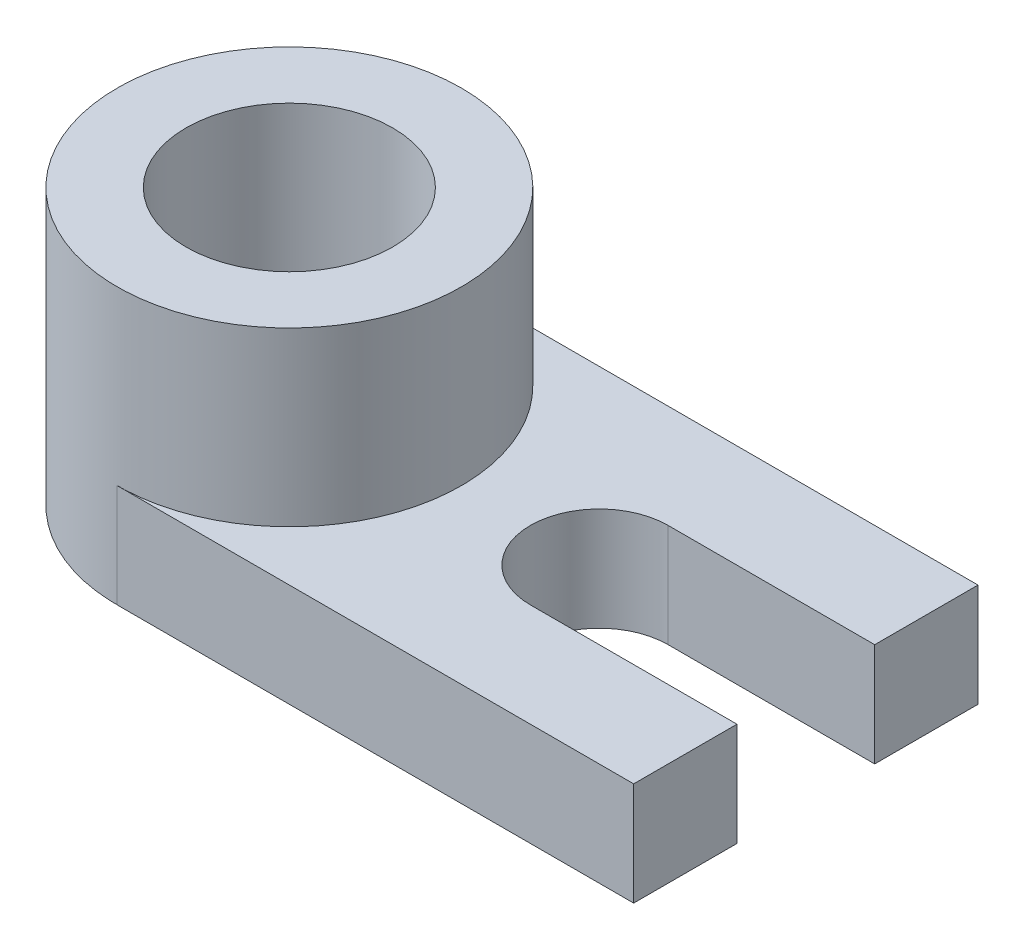
ISO-10303-21;
HEADER;
FILE_DESCRIPTION(('STEP AP214'),'2;1');
FILE_NAME('part.step','',(''),(''),'','','');
FILE_SCHEMA(('AUTOMOTIVE_DESIGN { 1 0 10303 214 1 1 1 1 }'));
ENDSEC;
DATA;
#1=APPLICATION_CONTEXT('core data for automotive mechanical design processes');
#2=APPLICATION_PROTOCOL_DEFINITION('international standard','automotive_design',2000,#1);
#3=PRODUCT_CONTEXT('',#1,'mechanical');
#4=PRODUCT('Part','Part','',(#3));
#5=PRODUCT_RELATED_PRODUCT_CATEGORY('part','',(#4));
#6=PRODUCT_DEFINITION_FORMATION('','',#4);
#7=PRODUCT_DEFINITION_CONTEXT('part definition',#1,'design');
#8=PRODUCT_DEFINITION('design','',#6,#7);
#9=PRODUCT_DEFINITION_SHAPE('','',#8);
#10=(LENGTH_UNIT() NAMED_UNIT(*) SI_UNIT(.MILLI.,.METRE.));
#11=(NAMED_UNIT(*) PLANE_ANGLE_UNIT() SI_UNIT($,.RADIAN.));
#12=(NAMED_UNIT(*) SI_UNIT($,.STERADIAN.) SOLID_ANGLE_UNIT());
#13=UNCERTAINTY_MEASURE_WITH_UNIT(LENGTH_MEASURE(1.E-05),#10,'distance_accuracy_value','');
#14=(GEOMETRIC_REPRESENTATION_CONTEXT(3) GLOBAL_UNCERTAINTY_ASSIGNED_CONTEXT((#13)) GLOBAL_UNIT_ASSIGNED_CONTEXT((#10,
#11,#12)) REPRESENTATION_CONTEXT('',''));
#15=CARTESIAN_POINT('',(0.,0.,0.));
#16=DIRECTION('',(0.,0.,1.));
#17=DIRECTION('',(1.,0.,0.));
#18=AXIS2_PLACEMENT_3D('',#15,#16,#17);
#19=CARTESIAN_POINT('',(0.,40.,-25.));
#20=DIRECTION('',(0.,-1.,0.));
#21=DIRECTION('',(0.,0.,-1.));
#22=AXIS2_PLACEMENT_3D('',#19,#20,#21);
#23=CYLINDRICAL_SURFACE('',#22,25.);
#24=CARTESIAN_POINT('',(0.,40.,-25.));
#25=DIRECTION('',(0.,-1.,0.));
#26=DIRECTION('',(0.,0.,-1.));
#27=AXIS2_PLACEMENT_3D('',#24,#25,#26);
#28=CIRCLE('',#27,25.);
#29=CARTESIAN_POINT('',(0.,40.,-50.));
#30=VERTEX_POINT('',#29);
#31=EDGE_CURVE('E11',#30,#30,#28,.T.);
#32=ORIENTED_EDGE('',*,*,#31,.T.);
#33=EDGE_LOOP('',(#32));
#34=FACE_BOUND('',#33,.T.);
#35=CARTESIAN_POINT('',(0.,0.,-25.));
#36=DIRECTION('',(0.,-1.,0.));
#37=DIRECTION('',(0.,0.,-1.));
#38=AXIS2_PLACEMENT_3D('',#35,#36,#37);
#39=CIRCLE('',#38,25.);
#40=CARTESIAN_POINT('',(0.,0.,-50.));
#41=VERTEX_POINT('',#40);
#42=EDGE_CURVE('E50',#41,#41,#39,.T.);
#43=ORIENTED_EDGE('',*,*,#42,.F.);
#44=EDGE_LOOP('',(#43));
#45=FACE_BOUND('',#44,.T.);
#46=ADVANCED_FACE('F47',(#34,#45),#23,.T.);
#47=CARTESIAN_POINT('',(0.,40.,-25.));
#48=DIRECTION('',(0.,-1.,0.));
#49=DIRECTION('',(0.,0.,-1.));
#50=AXIS2_PLACEMENT_3D('',#47,#48,#49);
#51=PLANE('',#50);
#52=CARTESIAN_POINT('',(0.,40.,-25.));
#53=DIRECTION('',(0.,1.,0.));
#54=DIRECTION('',(0.,0.,1.));
#55=AXIS2_PLACEMENT_3D('',#52,#53,#54);
#56=CIRCLE('',#55,15.);
#57=CARTESIAN_POINT('',(0.,40.,-10.));
#58=VERTEX_POINT('',#57);
#59=EDGE_CURVE('E61',#58,#58,#56,.T.);
#60=ORIENTED_EDGE('',*,*,#59,.F.);
#61=EDGE_LOOP('',(#60));
#62=FACE_BOUND('',#61,.T.);
#63=ORIENTED_EDGE('',*,*,#31,.F.);
#64=EDGE_LOOP('',(#63));
#65=FACE_BOUND('',#64,.T.);
#66=ADVANCED_FACE('F78',(#62,#65),#51,.F.);
#67=CARTESIAN_POINT('',(0.,0.,-25.));
#68=DIRECTION('',(0.,-1.,0.));
#69=DIRECTION('',(0.,0.,-1.));
#70=AXIS2_PLACEMENT_3D('',#67,#68,#69);
#71=PLANE('',#70);
#72=CARTESIAN_POINT('',(0.,0.,-25.));
#73=DIRECTION('',(0.,1.,0.));
#74=DIRECTION('',(0.,0.,1.));
#75=AXIS2_PLACEMENT_3D('',#72,#73,#74);
#76=CIRCLE('',#75,15.);
#77=CARTESIAN_POINT('',(0.,0.,-10.));
#78=VERTEX_POINT('',#77);
#79=EDGE_CURVE('E59',#78,#78,#76,.T.);
#80=ORIENTED_EDGE('',*,*,#79,.T.);
#81=EDGE_LOOP('',(#80));
#82=FACE_BOUND('',#81,.T.);
#83=ORIENTED_EDGE('',*,*,#42,.T.);
#84=EDGE_LOOP('',(#83));
#85=FACE_BOUND('',#84,.T.);
#86=ADVANCED_FACE('F69',(#82,#85),#71,.T.);
#87=CARTESIAN_POINT('',(0.,0.,-25.));
#88=DIRECTION('',(0.,1.,0.));
#89=DIRECTION('',(0.,0.,1.));
#90=AXIS2_PLACEMENT_3D('',#87,#88,#89);
#91=CYLINDRICAL_SURFACE('',#90,15.);
#92=ORIENTED_EDGE('',*,*,#79,.F.);
#93=EDGE_LOOP('',(#92));
#94=FACE_BOUND('',#93,.T.);
#95=ORIENTED_EDGE('',*,*,#59,.T.);
#96=EDGE_LOOP('',(#95));
#97=FACE_BOUND('',#96,.T.);
#98=ADVANCED_FACE('F72',(#94,#97),#91,.F.);
#99=CLOSED_SHELL('',(#46,#66,#86,#98));
#100=MANIFOLD_SOLID_BREP('B2',#99);
#101=CARTESIAN_POINT('',(75.,15.,-50.));
#102=DIRECTION('',(-1.,0.,0.));
#103=DIRECTION('',(0.,0.,1.));
#104=AXIS2_PLACEMENT_3D('',#101,#102,#103);
#105=PLANE('',#104);
#106=DIRECTION('',(0.,0.,-1.));
#107=VECTOR('',#106,1.);
#108=CARTESIAN_POINT('',(75.,0.,-50.));
#109=LINE('',#108,#107);
#110=CARTESIAN_POINT('',(75.,0.,0.));
#111=VERTEX_POINT('',#110);
#112=CARTESIAN_POINT('',(75.,0.,-15.));
#113=VERTEX_POINT('',#112);
#114=EDGE_CURVE('E204',#111,#113,#109,.T.);
#115=ORIENTED_EDGE('',*,*,#114,.T.);
#116=DIRECTION('',(0.,-1.,0.));
#117=VECTOR('',#116,1.);
#118=CARTESIAN_POINT('',(75.,15.,-15.));
#119=LINE('',#118,#117);
#120=CARTESIAN_POINT('',(75.,15.,-15.));
#121=VERTEX_POINT('',#120);
#122=EDGE_CURVE('E188',#121,#113,#119,.T.);
#123=ORIENTED_EDGE('',*,*,#122,.F.);
#124=DIRECTION('',(0.,0.,-1.));
#125=VECTOR('',#124,1.);
#126=CARTESIAN_POINT('',(75.,15.,-50.));
#127=LINE('',#126,#125);
#128=CARTESIAN_POINT('',(75.,15.,0.));
#129=VERTEX_POINT('',#128);
#130=EDGE_CURVE('E248',#129,#121,#127,.T.);
#131=ORIENTED_EDGE('',*,*,#130,.F.);
#132=DIRECTION('',(0.,-1.,0.));
#133=VECTOR('',#132,1.);
#134=CARTESIAN_POINT('',(75.,15.,0.));
#135=LINE('',#134,#133);
#136=EDGE_CURVE('E121',#129,#111,#135,.T.);
#137=ORIENTED_EDGE('',*,*,#136,.T.);
#138=EDGE_LOOP('',(#115,#123,#131,#137));
#139=FACE_BOUND('',#138,.T.);
#140=ADVANCED_FACE('F113',(#139),#105,.F.);
#141=CARTESIAN_POINT('',(0.,15.,-50.));
#142=DIRECTION('',(1.,0.,0.));
#143=DIRECTION('',(0.,0.,-1.));
#144=AXIS2_PLACEMENT_3D('',#141,#142,#143);
#145=PLANE('',#144);
#146=DIRECTION('',(0.,0.,1.));
#147=VECTOR('',#146,1.);
#148=CARTESIAN_POINT('',(0.,0.,-50.));
#149=LINE('',#148,#147);
#150=CARTESIAN_POINT('',(0.,0.,-50.));
#151=VERTEX_POINT('',#150);
#152=CARTESIAN_POINT('',(0.,0.,-40.));
#153=VERTEX_POINT('',#152);
#154=EDGE_CURVE('E239',#151,#153,#149,.T.);
#155=ORIENTED_EDGE('',*,*,#154,.T.);
#156=DIRECTION('',(0.,1.,0.));
#157=VECTOR('',#156,1.);
#158=CARTESIAN_POINT('',(0.,0.,-40.));
#159=LINE('',#158,#157);
#160=CARTESIAN_POINT('',(0.,15.,-40.));
#161=VERTEX_POINT('',#160);
#162=EDGE_CURVE('E245',#153,#161,#159,.T.);
#163=ORIENTED_EDGE('',*,*,#162,.T.);
#164=DIRECTION('',(0.,0.,1.));
#165=VECTOR('',#164,1.);
#166=CARTESIAN_POINT('',(0.,15.,-50.));
#167=LINE('',#166,#165);
#168=CARTESIAN_POINT('',(0.,15.,-50.));
#169=VERTEX_POINT('',#168);
#170=EDGE_CURVE('E253',#169,#161,#167,.T.);
#171=ORIENTED_EDGE('',*,*,#170,.F.);
#172=DIRECTION('',(0.,-1.,0.));
#173=VECTOR('',#172,1.);
#174=CARTESIAN_POINT('',(0.,15.,-50.));
#175=LINE('',#174,#173);
#176=EDGE_CURVE('E221',#169,#151,#175,.T.);
#177=ORIENTED_EDGE('',*,*,#176,.T.);
#178=EDGE_LOOP('',(#155,#163,#171,#177));
#179=FACE_BOUND('',#178,.T.);
#180=ADVANCED_FACE('F288',(#179),#145,.F.);
#181=CARTESIAN_POINT('',(0.,15.,-10.));
#182=VERTEX_POINT('',#181);
#183=CARTESIAN_POINT('',(0.,15.,0.));
#184=VERTEX_POINT('',#183);
#185=EDGE_CURVE('E215',#182,#184,#167,.T.);
#186=ORIENTED_EDGE('',*,*,#185,.F.);
#187=DIRECTION('',(0.,1.,0.));
#188=VECTOR('',#187,1.);
#189=CARTESIAN_POINT('',(0.,0.,-10.));
#190=LINE('',#189,#188);
#191=CARTESIAN_POINT('',(0.,0.,-10.));
#192=VERTEX_POINT('',#191);
#193=EDGE_CURVE('E257',#182,#192,#190,.F.);
#194=ORIENTED_EDGE('',*,*,#193,.T.);
#195=CARTESIAN_POINT('',(0.,0.,0.));
#196=VERTEX_POINT('',#195);
#197=EDGE_CURVE('E244',#192,#196,#149,.T.);
#198=ORIENTED_EDGE('',*,*,#197,.T.);
#199=DIRECTION('',(0.,-1.,0.));
#200=VECTOR('',#199,1.);
#201=CARTESIAN_POINT('',(0.,15.,0.));
#202=LINE('',#201,#200);
#203=EDGE_CURVE('E45',#184,#196,#202,.T.);
#204=ORIENTED_EDGE('',*,*,#203,.F.);
#205=EDGE_LOOP('',(#186,#194,#198,#204));
#206=FACE_BOUND('',#205,.T.);
#207=ADVANCED_FACE('F115',(#206),#145,.F.);
#208=CARTESIAN_POINT('',(0.,15.,0.));
#209=DIRECTION('',(0.,0.,-1.));
#210=DIRECTION('',(-1.,0.,0.));
#211=AXIS2_PLACEMENT_3D('',#208,#209,#210);
#212=PLANE('',#211);
#213=DIRECTION('',(1.,0.,0.));
#214=VECTOR('',#213,1.);
#215=CARTESIAN_POINT('',(0.,0.,0.));
#216=LINE('',#215,#214);
#217=EDGE_CURVE('E217',#196,#111,#216,.T.);
#218=ORIENTED_EDGE('',*,*,#217,.T.);
#219=ORIENTED_EDGE('',*,*,#136,.F.);
#220=DIRECTION('',(1.,0.,0.));
#221=VECTOR('',#220,1.);
#222=CARTESIAN_POINT('',(0.,15.,0.));
#223=LINE('',#222,#221);
#224=EDGE_CURVE('E251',#184,#129,#223,.T.);
#225=ORIENTED_EDGE('',*,*,#224,.F.);
#226=ORIENTED_EDGE('',*,*,#203,.T.);
#227=EDGE_LOOP('',(#218,#219,#225,#226));
#228=FACE_BOUND('',#227,.T.);
#229=ADVANCED_FACE('F283',(#228),#212,.F.);
#230=CARTESIAN_POINT('',(75.,15.,-35.));
#231=VERTEX_POINT('',#230);
#232=CARTESIAN_POINT('',(75.,15.,-50.));
#233=VERTEX_POINT('',#232);
#234=EDGE_CURVE('E250',#231,#233,#127,.T.);
#235=ORIENTED_EDGE('',*,*,#234,.F.);
#236=DIRECTION('',(0.,1.,0.));
#237=VECTOR('',#236,1.);
#238=CARTESIAN_POINT('',(75.,15.,-35.));
#239=LINE('',#238,#237);
#240=CARTESIAN_POINT('',(75.,0.,-35.));
#241=VERTEX_POINT('',#240);
#242=EDGE_CURVE('E196',#241,#231,#239,.T.);
#243=ORIENTED_EDGE('',*,*,#242,.F.);
#244=CARTESIAN_POINT('',(75.,0.,-50.));
#245=VERTEX_POINT('',#244);
#246=EDGE_CURVE('E213',#241,#245,#109,.T.);
#247=ORIENTED_EDGE('',*,*,#246,.T.);
#248=DIRECTION('',(0.,-1.,0.));
#249=VECTOR('',#248,1.);
#250=CARTESIAN_POINT('',(75.,15.,-50.));
#251=LINE('',#250,#249);
#252=EDGE_CURVE('E224',#233,#245,#251,.T.);
#253=ORIENTED_EDGE('',*,*,#252,.F.);
#254=EDGE_LOOP('',(#235,#243,#247,#253));
#255=FACE_BOUND('',#254,.T.);
#256=ADVANCED_FACE('F295',(#255),#105,.F.);
#257=CARTESIAN_POINT('',(0.,15.,-50.));
#258=DIRECTION('',(0.,0.,1.));
#259=DIRECTION('',(1.,0.,0.));
#260=AXIS2_PLACEMENT_3D('',#257,#258,#259);
#261=PLANE('',#260);
#262=DIRECTION('',(-1.,0.,0.));
#263=VECTOR('',#262,1.);
#264=CARTESIAN_POINT('',(0.,0.,-50.));
#265=LINE('',#264,#263);
#266=EDGE_CURVE('E212',#245,#151,#265,.T.);
#267=ORIENTED_EDGE('',*,*,#266,.T.);
#268=ORIENTED_EDGE('',*,*,#176,.F.);
#269=DIRECTION('',(-1.,0.,0.));
#270=VECTOR('',#269,1.);
#271=CARTESIAN_POINT('',(0.,15.,-50.));
#272=LINE('',#271,#270);
#273=EDGE_CURVE('E225',#233,#169,#272,.T.);
#274=ORIENTED_EDGE('',*,*,#273,.F.);
#275=ORIENTED_EDGE('',*,*,#252,.T.);
#276=EDGE_LOOP('',(#267,#268,#274,#275));
#277=FACE_BOUND('',#276,.T.);
#278=ADVANCED_FACE('F231',(#277),#261,.F.);
#279=CARTESIAN_POINT('',(0.,15.,0.));
#280=DIRECTION('',(0.,1.,0.));
#281=DIRECTION('',(0.,0.,1.));
#282=AXIS2_PLACEMENT_3D('',#279,#280,#281);
#283=PLANE('',#282);
#284=DIRECTION('',(1.,0.,0.));
#285=VECTOR('',#284,1.);
#286=CARTESIAN_POINT('',(-25.001,15.,-15.));
#287=LINE('',#286,#285);
#288=CARTESIAN_POINT('',(45.,15.,-15.));
#289=VERTEX_POINT('',#288);
#290=EDGE_CURVE('E191',#289,#121,#287,.T.);
#291=ORIENTED_EDGE('',*,*,#290,.F.);
#292=CARTESIAN_POINT('',(45.,15.,-25.));
#293=DIRECTION('',(0.,1.,0.));
#294=DIRECTION('',(0.,0.,1.));
#295=AXIS2_PLACEMENT_3D('',#292,#293,#294);
#296=CIRCLE('',#295,9.99999999999999);
#297=CARTESIAN_POINT('',(45.,15.,-35.));
#298=VERTEX_POINT('',#297);
#299=EDGE_CURVE('E264',#298,#289,#296,.T.);
#300=ORIENTED_EDGE('',*,*,#299,.F.);
#301=DIRECTION('',(1.,0.,0.));
#302=VECTOR('',#301,1.);
#303=CARTESIAN_POINT('',(-25.001,15.,-35.));
#304=LINE('',#303,#302);
#305=EDGE_CURVE('E128',#298,#231,#304,.T.);
#306=ORIENTED_EDGE('',*,*,#305,.T.);
#307=ORIENTED_EDGE('',*,*,#234,.T.);
#308=ORIENTED_EDGE('',*,*,#273,.T.);
#309=ORIENTED_EDGE('',*,*,#170,.T.);
#310=CARTESIAN_POINT('',(0.,15.,-25.));
#311=DIRECTION('',(0.,1.,0.));
#312=DIRECTION('',(0.,0.,1.));
#313=AXIS2_PLACEMENT_3D('',#310,#311,#312);
#314=CIRCLE('',#313,15.);
#315=EDGE_CURVE('E260',#182,#161,#314,.T.);
#316=ORIENTED_EDGE('',*,*,#315,.F.);
#317=ORIENTED_EDGE('',*,*,#185,.T.);
#318=ORIENTED_EDGE('',*,*,#224,.T.);
#319=ORIENTED_EDGE('',*,*,#130,.T.);
#320=EDGE_LOOP('',(#291,#300,#306,#307,#308,#309,#316,#317,#318,#319));
#321=FACE_BOUND('',#320,.T.);
#322=ADVANCED_FACE('F277',(#321),#283,.T.);
#323=CARTESIAN_POINT('',(0.,0.,0.));
#324=DIRECTION('',(0.,1.,0.));
#325=DIRECTION('',(0.,0.,1.));
#326=AXIS2_PLACEMENT_3D('',#323,#324,#325);
#327=PLANE('',#326);
#328=CARTESIAN_POINT('',(45.,0.,-25.));
#329=DIRECTION('',(0.,1.,0.));
#330=DIRECTION('',(0.,0.,1.));
#331=AXIS2_PLACEMENT_3D('',#328,#329,#330);
#332=CIRCLE('',#331,9.99999999999999);
#333=CARTESIAN_POINT('',(45.,0.,-35.));
#334=VERTEX_POINT('',#333);
#335=CARTESIAN_POINT('',(45.,0.,-15.));
#336=VERTEX_POINT('',#335);
#337=EDGE_CURVE('E207',#334,#336,#332,.T.);
#338=ORIENTED_EDGE('',*,*,#337,.T.);
#339=DIRECTION('',(1.,0.,0.));
#340=VECTOR('',#339,1.);
#341=CARTESIAN_POINT('',(-25.001,0.,-15.));
#342=LINE('',#341,#340);
#343=EDGE_CURVE('E136',#336,#113,#342,.T.);
#344=ORIENTED_EDGE('',*,*,#343,.T.);
#345=ORIENTED_EDGE('',*,*,#114,.F.);
#346=ORIENTED_EDGE('',*,*,#217,.F.);
#347=ORIENTED_EDGE('',*,*,#197,.F.);
#348=CARTESIAN_POINT('',(0.,0.,-25.));
#349=DIRECTION('',(0.,1.,0.));
#350=DIRECTION('',(0.,0.,1.));
#351=AXIS2_PLACEMENT_3D('',#348,#349,#350);
#352=CIRCLE('',#351,15.);
#353=EDGE_CURVE('E241',#192,#153,#352,.T.);
#354=ORIENTED_EDGE('',*,*,#353,.T.);
#355=ORIENTED_EDGE('',*,*,#154,.F.);
#356=ORIENTED_EDGE('',*,*,#266,.F.);
#357=ORIENTED_EDGE('',*,*,#246,.F.);
#358=DIRECTION('',(1.,0.,0.));
#359=VECTOR('',#358,1.);
#360=CARTESIAN_POINT('',(-25.001,0.,-35.));
#361=LINE('',#360,#359);
#362=EDGE_CURVE('E208',#334,#241,#361,.T.);
#363=ORIENTED_EDGE('',*,*,#362,.F.);
#364=EDGE_LOOP('',(#338,#344,#345,#346,#347,#354,#355,#356,#357,#363));
#365=FACE_BOUND('',#364,.T.);
#366=ADVANCED_FACE('F202',(#365),#327,.F.);
#367=CARTESIAN_POINT('',(0.,0.,-25.));
#368=DIRECTION('',(0.,1.,0.));
#369=DIRECTION('',(0.,0.,1.));
#370=AXIS2_PLACEMENT_3D('',#367,#368,#369);
#371=CYLINDRICAL_SURFACE('',#370,15.);
#372=ORIENTED_EDGE('',*,*,#353,.F.);
#373=ORIENTED_EDGE('',*,*,#193,.F.);
#374=ORIENTED_EDGE('',*,*,#315,.T.);
#375=ORIENTED_EDGE('',*,*,#162,.F.);
#376=EDGE_LOOP('',(#372,#373,#374,#375));
#377=FACE_BOUND('',#376,.T.);
#378=ADVANCED_FACE('F286',(#377),#371,.F.);
#379=CARTESIAN_POINT('',(45.,15.,-25.));
#380=DIRECTION('',(0.,1.,0.));
#381=DIRECTION('',(0.,0.,1.));
#382=AXIS2_PLACEMENT_3D('',#379,#380,#381);
#383=CYLINDRICAL_SURFACE('',#382,9.99999999999999);
#384=ORIENTED_EDGE('',*,*,#299,.T.);
#385=DIRECTION('',(0.,1.,0.));
#386=VECTOR('',#385,1.);
#387=CARTESIAN_POINT('',(45.,15.,-15.));
#388=LINE('',#387,#386);
#389=EDGE_CURVE('E197',#336,#289,#388,.T.);
#390=ORIENTED_EDGE('',*,*,#389,.F.);
#391=ORIENTED_EDGE('',*,*,#337,.F.);
#392=DIRECTION('',(0.,1.,0.));
#393=VECTOR('',#392,1.);
#394=CARTESIAN_POINT('',(45.,15.,-35.));
#395=LINE('',#394,#393);
#396=EDGE_CURVE('E272',#334,#298,#395,.T.);
#397=ORIENTED_EDGE('',*,*,#396,.T.);
#398=EDGE_LOOP('',(#384,#390,#391,#397));
#399=FACE_BOUND('',#398,.T.);
#400=ADVANCED_FACE('F275',(#399),#383,.F.);
#401=CARTESIAN_POINT('',(-25.001,15.,-35.));
#402=DIRECTION('',(0.,0.,-1.));
#403=DIRECTION('',(-1.,0.,0.));
#404=AXIS2_PLACEMENT_3D('',#401,#402,#403);
#405=PLANE('',#404);
#406=ORIENTED_EDGE('',*,*,#362,.T.);
#407=ORIENTED_EDGE('',*,*,#242,.T.);
#408=ORIENTED_EDGE('',*,*,#305,.F.);
#409=ORIENTED_EDGE('',*,*,#396,.F.);
#410=EDGE_LOOP('',(#406,#407,#408,#409));
#411=FACE_BOUND('',#410,.T.);
#412=ADVANCED_FACE('F305',(#411),#405,.F.);
#413=CARTESIAN_POINT('',(-25.001,15.,-15.));
#414=DIRECTION('',(0.,0.,1.));
#415=DIRECTION('',(1.,0.,0.));
#416=AXIS2_PLACEMENT_3D('',#413,#414,#415);
#417=PLANE('',#416);
#418=ORIENTED_EDGE('',*,*,#389,.T.);
#419=ORIENTED_EDGE('',*,*,#290,.T.);
#420=ORIENTED_EDGE('',*,*,#122,.T.);
#421=ORIENTED_EDGE('',*,*,#343,.F.);
#422=EDGE_LOOP('',(#418,#419,#420,#421));
#423=FACE_BOUND('',#422,.T.);
#424=ADVANCED_FACE('F189',(#423),#417,.F.);
#425=CLOSED_SHELL('',(#140,#180,#207,#229,#256,#278,#322,#366,#378,#400,#412,#424));
#426=MANIFOLD_SOLID_BREP('B6',#425);
#427=ADVANCED_BREP_SHAPE_REPRESENTATION('',(#18,#100,#426),#14);
#428=SHAPE_DEFINITION_REPRESENTATION(#9,#427);
ENDSEC;
END-ISO-10303-21;
